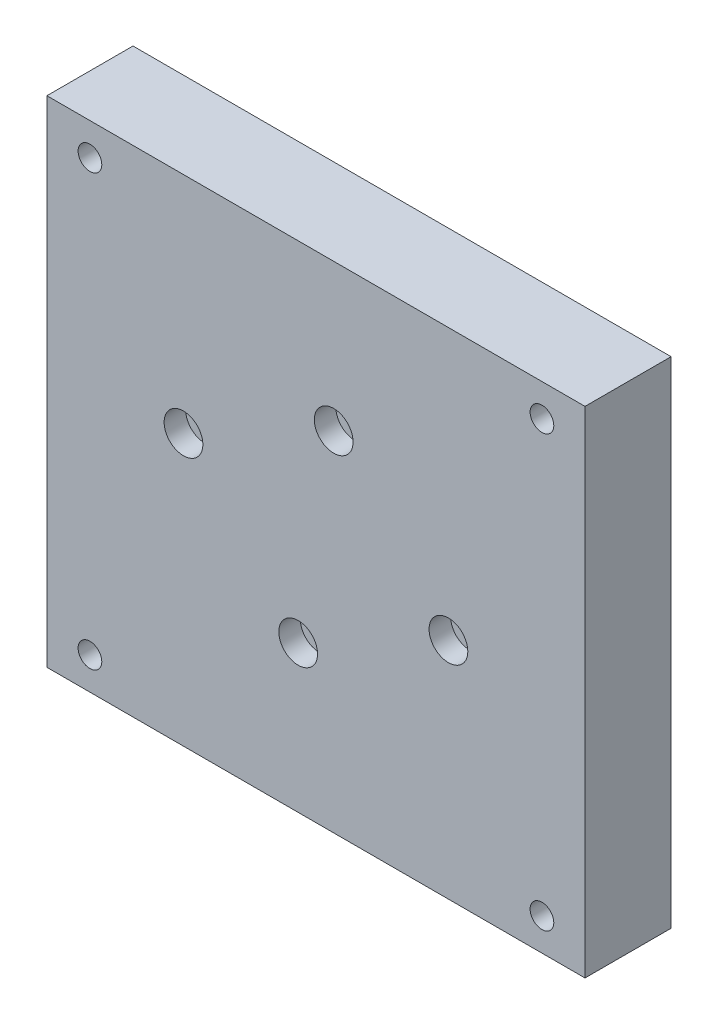
ISO-10303-21;
HEADER;
FILE_DESCRIPTION(('STEP AP214'),'2;1');
FILE_NAME('part.step','',(''),(''),'','','');
FILE_SCHEMA(('AUTOMOTIVE_DESIGN { 1 0 10303 214 1 1 1 1 }'));
ENDSEC;
DATA;
#1=APPLICATION_CONTEXT('core data for automotive mechanical design processes');
#2=APPLICATION_PROTOCOL_DEFINITION('international standard','automotive_design',2000,#1);
#3=PRODUCT_CONTEXT('',#1,'mechanical');
#4=PRODUCT('Part','Part','',(#3));
#5=PRODUCT_RELATED_PRODUCT_CATEGORY('part','',(#4));
#6=PRODUCT_DEFINITION_FORMATION('','',#4);
#7=PRODUCT_DEFINITION_CONTEXT('part definition',#1,'design');
#8=PRODUCT_DEFINITION('design','',#6,#7);
#9=PRODUCT_DEFINITION_SHAPE('','',#8);
#10=(LENGTH_UNIT() NAMED_UNIT(*) SI_UNIT(.MILLI.,.METRE.));
#11=(NAMED_UNIT(*) PLANE_ANGLE_UNIT() SI_UNIT($,.RADIAN.));
#12=(NAMED_UNIT(*) SI_UNIT($,.STERADIAN.) SOLID_ANGLE_UNIT());
#13=UNCERTAINTY_MEASURE_WITH_UNIT(LENGTH_MEASURE(1.E-05),#10,'distance_accuracy_value','');
#14=(GEOMETRIC_REPRESENTATION_CONTEXT(3) GLOBAL_UNCERTAINTY_ASSIGNED_CONTEXT((#13)) GLOBAL_UNIT_ASSIGNED_CONTEXT((#10,
#11,#12)) REPRESENTATION_CONTEXT('',''));
#15=CARTESIAN_POINT('',(0.,0.,0.));
#16=DIRECTION('',(0.,0.,1.));
#17=DIRECTION('',(1.,0.,0.));
#18=AXIS2_PLACEMENT_3D('',#15,#16,#17);
#19=CARTESIAN_POINT('',(25.,-23.,8.));
#20=DIRECTION('',(-1.,0.,0.));
#21=DIRECTION('',(0.,0.,1.));
#22=AXIS2_PLACEMENT_3D('',#19,#20,#21);
#23=PLANE('',#22);
#24=DIRECTION('',(0.,1.,0.));
#25=VECTOR('',#24,1.);
#26=CARTESIAN_POINT('',(25.,-23.,0.));
#27=LINE('',#26,#25);
#28=CARTESIAN_POINT('',(25.,-23.,0.));
#29=VERTEX_POINT('',#28);
#30=CARTESIAN_POINT('',(25.,23.,0.));
#31=VERTEX_POINT('',#30);
#32=EDGE_CURVE('E100',#29,#31,#27,.T.);
#33=ORIENTED_EDGE('',*,*,#32,.T.);
#34=DIRECTION('',(0.,0.,-1.));
#35=VECTOR('',#34,1.);
#36=CARTESIAN_POINT('',(25.,23.,8.));
#37=LINE('',#36,#35);
#38=CARTESIAN_POINT('',(25.,23.,8.));
#39=VERTEX_POINT('',#38);
#40=EDGE_CURVE('E11',#39,#31,#37,.T.);
#41=ORIENTED_EDGE('',*,*,#40,.F.);
#42=DIRECTION('',(0.,1.,0.));
#43=VECTOR('',#42,1.);
#44=CARTESIAN_POINT('',(25.,-23.,8.));
#45=LINE('',#44,#43);
#46=CARTESIAN_POINT('',(25.,-23.,8.));
#47=VERTEX_POINT('',#46);
#48=EDGE_CURVE('E85',#47,#39,#45,.T.);
#49=ORIENTED_EDGE('',*,*,#48,.F.);
#50=DIRECTION('',(0.,0.,-1.));
#51=VECTOR('',#50,1.);
#52=CARTESIAN_POINT('',(25.,-23.,8.));
#53=LINE('',#52,#51);
#54=EDGE_CURVE('E52',#47,#29,#53,.T.);
#55=ORIENTED_EDGE('',*,*,#54,.T.);
#56=EDGE_LOOP('',(#33,#41,#49,#55));
#57=FACE_BOUND('',#56,.T.);
#58=ADVANCED_FACE('F34',(#57),#23,.F.);
#59=CARTESIAN_POINT('',(25.,23.,8.));
#60=DIRECTION('',(0.,-1.,0.));
#61=DIRECTION('',(0.,0.,-1.));
#62=AXIS2_PLACEMENT_3D('',#59,#60,#61);
#63=PLANE('',#62);
#64=DIRECTION('',(-1.,0.,0.));
#65=VECTOR('',#64,1.);
#66=CARTESIAN_POINT('',(25.,23.,0.));
#67=LINE('',#66,#65);
#68=CARTESIAN_POINT('',(-25.,23.,0.));
#69=VERTEX_POINT('',#68);
#70=EDGE_CURVE('E90',#31,#69,#67,.T.);
#71=ORIENTED_EDGE('',*,*,#70,.T.);
#72=DIRECTION('',(0.,0.,-1.));
#73=VECTOR('',#72,1.);
#74=CARTESIAN_POINT('',(-25.,23.,8.));
#75=LINE('',#74,#73);
#76=CARTESIAN_POINT('',(-25.,23.,8.));
#77=VERTEX_POINT('',#76);
#78=EDGE_CURVE('E43',#77,#69,#75,.T.);
#79=ORIENTED_EDGE('',*,*,#78,.F.);
#80=DIRECTION('',(-1.,0.,0.));
#81=VECTOR('',#80,1.);
#82=CARTESIAN_POINT('',(25.,23.,8.));
#83=LINE('',#82,#81);
#84=EDGE_CURVE('E77',#39,#77,#83,.T.);
#85=ORIENTED_EDGE('',*,*,#84,.F.);
#86=ORIENTED_EDGE('',*,*,#40,.T.);
#87=EDGE_LOOP('',(#71,#79,#85,#86));
#88=FACE_BOUND('',#87,.T.);
#89=ADVANCED_FACE('F89',(#88),#63,.F.);
#90=CARTESIAN_POINT('',(-25.,-23.,8.));
#91=DIRECTION('',(-1.,0.,0.));
#92=DIRECTION('',(0.,-1.,0.));
#93=AXIS2_PLACEMENT_3D('',#90,#91,#92);
#94=PLANE('',#93);
#95=DIRECTION('',(0.,1.,0.));
#96=VECTOR('',#95,1.);
#97=CARTESIAN_POINT('',(-25.,-23.,0.));
#98=LINE('',#97,#96);
#99=CARTESIAN_POINT('',(-25.,-23.,0.));
#100=VERTEX_POINT('',#99);
#101=EDGE_CURVE('E104',#100,#69,#98,.T.);
#102=ORIENTED_EDGE('',*,*,#101,.F.);
#103=DIRECTION('',(0.,0.,-1.));
#104=VECTOR('',#103,1.);
#105=CARTESIAN_POINT('',(-25.,-23.,8.));
#106=LINE('',#105,#104);
#107=CARTESIAN_POINT('',(-25.,-23.,8.));
#108=VERTEX_POINT('',#107);
#109=EDGE_CURVE('E66',#108,#100,#106,.T.);
#110=ORIENTED_EDGE('',*,*,#109,.F.);
#111=DIRECTION('',(0.,1.,0.));
#112=VECTOR('',#111,1.);
#113=CARTESIAN_POINT('',(-25.,-23.,8.));
#114=LINE('',#113,#112);
#115=EDGE_CURVE('E84',#108,#77,#114,.T.);
#116=ORIENTED_EDGE('',*,*,#115,.T.);
#117=ORIENTED_EDGE('',*,*,#78,.T.);
#118=EDGE_LOOP('',(#102,#110,#116,#117));
#119=FACE_BOUND('',#118,.T.);
#120=ADVANCED_FACE('F94',(#119),#94,.T.);
#121=CARTESIAN_POINT('',(25.,-23.,8.));
#122=DIRECTION('',(0.,-1.,0.));
#123=DIRECTION('',(0.,0.,-1.));
#124=AXIS2_PLACEMENT_3D('',#121,#122,#123);
#125=PLANE('',#124);
#126=DIRECTION('',(-1.,0.,0.));
#127=VECTOR('',#126,1.);
#128=CARTESIAN_POINT('',(25.,-23.,0.));
#129=LINE('',#128,#127);
#130=EDGE_CURVE('E106',#29,#100,#129,.T.);
#131=ORIENTED_EDGE('',*,*,#130,.F.);
#132=ORIENTED_EDGE('',*,*,#54,.F.);
#133=DIRECTION('',(-1.,0.,0.));
#134=VECTOR('',#133,1.);
#135=CARTESIAN_POINT('',(25.,-23.,8.));
#136=LINE('',#135,#134);
#137=EDGE_CURVE('E95',#47,#108,#136,.T.);
#138=ORIENTED_EDGE('',*,*,#137,.T.);
#139=ORIENTED_EDGE('',*,*,#109,.T.);
#140=EDGE_LOOP('',(#131,#132,#138,#139));
#141=FACE_BOUND('',#140,.T.);
#142=ADVANCED_FACE('F169',(#141),#125,.T.);
#143=CARTESIAN_POINT('',(0.,0.,8.));
#144=DIRECTION('',(0.,0.,1.));
#145=DIRECTION('',(1.,0.,0.));
#146=AXIS2_PLACEMENT_3D('',#143,#144,#145);
#147=PLANE('',#146);
#148=CARTESIAN_POINT('',(21.,20.,8.));
#149=DIRECTION('',(0.,0.,1.));
#150=DIRECTION('',(1.,0.,0.));
#151=AXIS2_PLACEMENT_3D('',#148,#149,#150);
#152=CIRCLE('',#151,1.1);
#153=CARTESIAN_POINT('',(22.1,20.,8.));
#154=VERTEX_POINT('',#153);
#155=EDGE_CURVE('E310',#154,#154,#152,.F.);
#156=ORIENTED_EDGE('',*,*,#155,.T.);
#157=EDGE_LOOP('',(#156));
#158=FACE_BOUND('',#157,.T.);
#159=CARTESIAN_POINT('',(-21.,20.,8.));
#160=DIRECTION('',(0.,0.,1.));
#161=DIRECTION('',(1.,0.,0.));
#162=AXIS2_PLACEMENT_3D('',#159,#160,#161);
#163=CIRCLE('',#162,1.1);
#164=CARTESIAN_POINT('',(-19.9,20.,8.));
#165=VERTEX_POINT('',#164);
#166=EDGE_CURVE('E315',#165,#165,#163,.F.);
#167=ORIENTED_EDGE('',*,*,#166,.T.);
#168=EDGE_LOOP('',(#167));
#169=FACE_BOUND('',#168,.T.);
#170=CARTESIAN_POINT('',(21.,-20.,8.));
#171=DIRECTION('',(0.,0.,1.));
#172=DIRECTION('',(1.,0.,0.));
#173=AXIS2_PLACEMENT_3D('',#170,#171,#172);
#174=CIRCLE('',#173,1.1);
#175=CARTESIAN_POINT('',(22.1,-20.,8.));
#176=VERTEX_POINT('',#175);
#177=EDGE_CURVE('E205',#176,#176,#174,.T.);
#178=ORIENTED_EDGE('',*,*,#177,.F.);
#179=EDGE_LOOP('',(#178));
#180=FACE_BOUND('',#179,.T.);
#181=CARTESIAN_POINT('',(-21.,-20.,8.));
#182=DIRECTION('',(0.,0.,1.));
#183=DIRECTION('',(1.,0.,0.));
#184=AXIS2_PLACEMENT_3D('',#181,#182,#183);
#185=CIRCLE('',#184,1.1);
#186=CARTESIAN_POINT('',(-19.9,-20.,8.));
#187=VERTEX_POINT('',#186);
#188=EDGE_CURVE('E204',#187,#187,#185,.T.);
#189=ORIENTED_EDGE('',*,*,#188,.F.);
#190=EDGE_LOOP('',(#189));
#191=FACE_BOUND('',#190,.T.);
#192=CARTESIAN_POINT('',(1.64965768783578,9.35567365361599,8.));
#193=DIRECTION('',(0.,0.,1.));
#194=DIRECTION('',(1.,0.,0.));
#195=AXIS2_PLACEMENT_3D('',#192,#193,#194);
#196=CIRCLE('',#195,1.8);
#197=CARTESIAN_POINT('',(3.44965768783578,9.35567365361599,8.));
#198=VERTEX_POINT('',#197);
#199=EDGE_CURVE('E216',#198,#198,#196,.T.);
#200=ORIENTED_EDGE('',*,*,#199,.F.);
#201=EDGE_LOOP('',(#200));
#202=FACE_BOUND('',#201,.T.);
#203=CARTESIAN_POINT('',(12.3100969126526,-2.17060222083655,8.));
#204=DIRECTION('',(0.,0.,1.));
#205=DIRECTION('',(1.,0.,0.));
#206=AXIS2_PLACEMENT_3D('',#203,#204,#205);
#207=CIRCLE('',#206,1.8);
#208=CARTESIAN_POINT('',(14.1100969126526,-2.17060222083655,8.));
#209=VERTEX_POINT('',#208);
#210=EDGE_CURVE('E222',#209,#209,#207,.T.);
#211=ORIENTED_EDGE('',*,*,#210,.F.);
#212=EDGE_LOOP('',(#211));
#213=FACE_BOUND('',#212,.T.);
#214=CARTESIAN_POINT('',(-1.64965768783577,-9.35567365361599,8.));
#215=DIRECTION('',(0.,0.,1.));
#216=DIRECTION('',(1.,0.,0.));
#217=AXIS2_PLACEMENT_3D('',#214,#215,#216);
#218=CIRCLE('',#217,1.8);
#219=CARTESIAN_POINT('',(0.150342312164225,-9.35567365361599,8.));
#220=VERTEX_POINT('',#219);
#221=EDGE_CURVE('E208',#220,#220,#218,.T.);
#222=ORIENTED_EDGE('',*,*,#221,.F.);
#223=EDGE_LOOP('',(#222));
#224=FACE_BOUND('',#223,.T.);
#225=CARTESIAN_POINT('',(-12.3100969126526,2.17060222083655,8.));
#226=DIRECTION('',(0.,0.,1.));
#227=DIRECTION('',(1.,0.,0.));
#228=AXIS2_PLACEMENT_3D('',#225,#226,#227);
#229=CIRCLE('',#228,1.8);
#230=CARTESIAN_POINT('',(-10.5100969126526,2.17060222083655,8.));
#231=VERTEX_POINT('',#230);
#232=EDGE_CURVE('E124',#231,#231,#229,.T.);
#233=ORIENTED_EDGE('',*,*,#232,.F.);
#234=EDGE_LOOP('',(#233));
#235=FACE_BOUND('',#234,.T.);
#236=ORIENTED_EDGE('',*,*,#48,.T.);
#237=ORIENTED_EDGE('',*,*,#84,.T.);
#238=ORIENTED_EDGE('',*,*,#115,.F.);
#239=ORIENTED_EDGE('',*,*,#137,.F.);
#240=EDGE_LOOP('',(#236,#237,#238,#239));
#241=FACE_BOUND('',#240,.T.);
#242=ADVANCED_FACE('F81',(#158,#169,#180,#191,#202,#213,#224,#235,#241),#147,.T.);
#243=CARTESIAN_POINT('',(0.,0.,0.));
#244=DIRECTION('',(0.,0.,1.));
#245=DIRECTION('',(1.,0.,0.));
#246=AXIS2_PLACEMENT_3D('',#243,#244,#245);
#247=PLANE('',#246);
#248=CARTESIAN_POINT('',(21.,20.,0.));
#249=DIRECTION('',(0.,0.,1.));
#250=DIRECTION('',(-1.,0.,0.));
#251=AXIS2_PLACEMENT_3D('',#248,#249,#250);
#252=CIRCLE('',#251,1.1);
#253=CARTESIAN_POINT('',(19.9,20.,0.));
#254=VERTEX_POINT('',#253);
#255=EDGE_CURVE('E191',#254,#254,#252,.T.);
#256=ORIENTED_EDGE('',*,*,#255,.T.);
#257=EDGE_LOOP('',(#256));
#258=FACE_BOUND('',#257,.T.);
#259=CARTESIAN_POINT('',(-21.,20.,0.));
#260=DIRECTION('',(0.,0.,1.));
#261=DIRECTION('',(-1.,0.,0.));
#262=AXIS2_PLACEMENT_3D('',#259,#260,#261);
#263=CIRCLE('',#262,1.1);
#264=CARTESIAN_POINT('',(-22.1,20.,0.));
#265=VERTEX_POINT('',#264);
#266=EDGE_CURVE('E195',#265,#265,#263,.T.);
#267=ORIENTED_EDGE('',*,*,#266,.T.);
#268=EDGE_LOOP('',(#267));
#269=FACE_BOUND('',#268,.T.);
#270=CARTESIAN_POINT('',(21.,-20.,0.));
#271=DIRECTION('',(0.,0.,-1.));
#272=DIRECTION('',(-1.,0.,0.));
#273=AXIS2_PLACEMENT_3D('',#270,#271,#272);
#274=CIRCLE('',#273,1.1);
#275=CARTESIAN_POINT('',(19.9,-20.,0.));
#276=VERTEX_POINT('',#275);
#277=EDGE_CURVE('E199',#276,#276,#274,.T.);
#278=ORIENTED_EDGE('',*,*,#277,.F.);
#279=EDGE_LOOP('',(#278));
#280=FACE_BOUND('',#279,.T.);
#281=CARTESIAN_POINT('',(-21.,-20.,0.));
#282=DIRECTION('',(0.,0.,-1.));
#283=DIRECTION('',(-1.,0.,0.));
#284=AXIS2_PLACEMENT_3D('',#281,#282,#283);
#285=CIRCLE('',#284,1.1);
#286=CARTESIAN_POINT('',(-22.1,-20.,0.));
#287=VERTEX_POINT('',#286);
#288=EDGE_CURVE('E202',#287,#287,#285,.T.);
#289=ORIENTED_EDGE('',*,*,#288,.F.);
#290=EDGE_LOOP('',(#289));
#291=FACE_BOUND('',#290,.T.);
#292=ORIENTED_EDGE('',*,*,#32,.F.);
#293=ORIENTED_EDGE('',*,*,#130,.T.);
#294=ORIENTED_EDGE('',*,*,#101,.T.);
#295=ORIENTED_EDGE('',*,*,#70,.F.);
#296=EDGE_LOOP('',(#292,#293,#294,#295));
#297=FACE_BOUND('',#296,.T.);
#298=ADVANCED_FACE('F168',(#258,#269,#280,#291,#297),#247,.F.);
#299=CARTESIAN_POINT('',(-12.3100969126526,2.17060222083655,6.));
#300=DIRECTION('',(0.,0.,1.));
#301=DIRECTION('',(1.,0.,0.));
#302=AXIS2_PLACEMENT_3D('',#299,#300,#301);
#303=PLANE('',#302);
#304=CARTESIAN_POINT('',(-12.3100969126526,2.17060222083655,6.));
#305=DIRECTION('',(0.,0.,1.));
#306=DIRECTION('',(1.,0.,0.));
#307=AXIS2_PLACEMENT_3D('',#304,#305,#306);
#308=CIRCLE('',#307,1.8);
#309=CARTESIAN_POINT('',(-10.5100969126526,2.17060222083655,6.));
#310=VERTEX_POINT('',#309);
#311=EDGE_CURVE('E115',#310,#310,#308,.T.);
#312=ORIENTED_EDGE('',*,*,#311,.T.);
#313=EDGE_LOOP('',(#312));
#314=FACE_BOUND('',#313,.T.);
#315=CARTESIAN_POINT('',(-12.3100969126526,2.17060222083655,6.));
#316=DIRECTION('',(0.,0.,1.));
#317=DIRECTION('',(1.,0.,0.));
#318=AXIS2_PLACEMENT_3D('',#315,#316,#317);
#319=CIRCLE('',#318,1.02499999999999);
#320=CARTESIAN_POINT('',(-11.2850969126526,2.17060222083655,6.));
#321=VERTEX_POINT('',#320);
#322=EDGE_CURVE('E111',#321,#321,#319,.F.);
#323=ORIENTED_EDGE('',*,*,#322,.T.);
#324=EDGE_LOOP('',(#323));
#325=FACE_BOUND('',#324,.T.);
#326=ADVANCED_FACE('F180',(#314,#325),#303,.T.);
#327=CARTESIAN_POINT('',(-12.3100969126526,2.17060222083655,6.));
#328=DIRECTION('',(0.,0.,1.));
#329=DIRECTION('',(1.,0.,0.));
#330=AXIS2_PLACEMENT_3D('',#327,#328,#329);
#331=CYLINDRICAL_SURFACE('',#330,1.8);
#332=ORIENTED_EDGE('',*,*,#311,.F.);
#333=EDGE_LOOP('',(#332));
#334=FACE_BOUND('',#333,.T.);
#335=ORIENTED_EDGE('',*,*,#232,.T.);
#336=EDGE_LOOP('',(#335));
#337=FACE_BOUND('',#336,.T.);
#338=ADVANCED_FACE('F185',(#334,#337),#331,.F.);
#339=CARTESIAN_POINT('',(-12.3100969126526,2.17060222083655,3.));
#340=DIRECTION('',(0.,0.,1.));
#341=DIRECTION('',(1.,0.,0.));
#342=AXIS2_PLACEMENT_3D('',#339,#340,#341);
#343=PLANE('',#342);
#344=CARTESIAN_POINT('',(-12.3100969126526,2.17060222083655,3.));
#345=DIRECTION('',(0.,0.,1.));
#346=DIRECTION('',(1.,0.,0.));
#347=AXIS2_PLACEMENT_3D('',#344,#345,#346);
#348=CIRCLE('',#347,1.02499999999999);
#349=CARTESIAN_POINT('',(-11.2850969126526,2.17060222083655,3.));
#350=VERTEX_POINT('',#349);
#351=EDGE_CURVE('E114',#350,#350,#348,.T.);
#352=ORIENTED_EDGE('',*,*,#351,.T.);
#353=EDGE_LOOP('',(#352));
#354=FACE_BOUND('',#353,.T.);
#355=ADVANCED_FACE('F252',(#354),#343,.T.);
#356=CARTESIAN_POINT('',(-12.3100969126526,2.17060222083655,3.));
#357=DIRECTION('',(0.,0.,1.));
#358=DIRECTION('',(1.,0.,0.));
#359=AXIS2_PLACEMENT_3D('',#356,#357,#358);
#360=CYLINDRICAL_SURFACE('',#359,1.02499999999999);
#361=ORIENTED_EDGE('',*,*,#351,.F.);
#362=EDGE_LOOP('',(#361));
#363=FACE_BOUND('',#362,.T.);
#364=ORIENTED_EDGE('',*,*,#322,.F.);
#365=EDGE_LOOP('',(#364));
#366=FACE_BOUND('',#365,.T.);
#367=ADVANCED_FACE('F267',(#363,#366),#360,.F.);
#368=CARTESIAN_POINT('',(12.3100969126526,-2.17060222083655,6.));
#369=DIRECTION('',(0.,0.,1.));
#370=DIRECTION('',(1.,0.,0.));
#371=AXIS2_PLACEMENT_3D('',#368,#369,#370);
#372=PLANE('',#371);
#373=CARTESIAN_POINT('',(12.3100969126526,-2.17060222083655,6.));
#374=DIRECTION('',(0.,0.,1.));
#375=DIRECTION('',(1.,0.,0.));
#376=AXIS2_PLACEMENT_3D('',#373,#374,#375);
#377=CIRCLE('',#376,1.8);
#378=CARTESIAN_POINT('',(14.1100969126526,-2.17060222083655,6.));
#379=VERTEX_POINT('',#378);
#380=EDGE_CURVE('E219',#379,#379,#377,.T.);
#381=ORIENTED_EDGE('',*,*,#380,.T.);
#382=EDGE_LOOP('',(#381));
#383=FACE_BOUND('',#382,.T.);
#384=CARTESIAN_POINT('',(12.3100969126526,-2.17060222083655,6.));
#385=DIRECTION('',(0.,0.,1.));
#386=DIRECTION('',(1.,0.,0.));
#387=AXIS2_PLACEMENT_3D('',#384,#385,#386);
#388=CIRCLE('',#387,1.02499999999999);
#389=CARTESIAN_POINT('',(13.3350969126526,-2.17060222083655,6.));
#390=VERTEX_POINT('',#389);
#391=EDGE_CURVE('E116',#390,#390,#388,.F.);
#392=ORIENTED_EDGE('',*,*,#391,.T.);
#393=EDGE_LOOP('',(#392));
#394=FACE_BOUND('',#393,.T.);
#395=ADVANCED_FACE('F270',(#383,#394),#372,.T.);
#396=CARTESIAN_POINT('',(12.3100969126526,-2.17060222083655,6.));
#397=DIRECTION('',(0.,0.,1.));
#398=DIRECTION('',(1.,0.,0.));
#399=AXIS2_PLACEMENT_3D('',#396,#397,#398);
#400=CYLINDRICAL_SURFACE('',#399,1.8);
#401=ORIENTED_EDGE('',*,*,#380,.F.);
#402=EDGE_LOOP('',(#401));
#403=FACE_BOUND('',#402,.T.);
#404=ORIENTED_EDGE('',*,*,#210,.T.);
#405=EDGE_LOOP('',(#404));
#406=FACE_BOUND('',#405,.T.);
#407=ADVANCED_FACE('F275',(#403,#406),#400,.F.);
#408=CARTESIAN_POINT('',(1.64965768783578,9.35567365361599,6.));
#409=DIRECTION('',(0.,0.,1.));
#410=DIRECTION('',(1.,0.,0.));
#411=AXIS2_PLACEMENT_3D('',#408,#409,#410);
#412=PLANE('',#411);
#413=CARTESIAN_POINT('',(1.64965768783578,9.35567365361599,6.));
#414=DIRECTION('',(0.,0.,1.));
#415=DIRECTION('',(1.,0.,0.));
#416=AXIS2_PLACEMENT_3D('',#413,#414,#415);
#417=CIRCLE('',#416,1.8);
#418=CARTESIAN_POINT('',(3.44965768783578,9.35567365361599,6.));
#419=VERTEX_POINT('',#418);
#420=EDGE_CURVE('E119',#419,#419,#417,.T.);
#421=ORIENTED_EDGE('',*,*,#420,.T.);
#422=EDGE_LOOP('',(#421));
#423=FACE_BOUND('',#422,.T.);
#424=CARTESIAN_POINT('',(1.64965768783578,9.35567365361599,6.));
#425=DIRECTION('',(0.,0.,1.));
#426=DIRECTION('',(1.,0.,0.));
#427=AXIS2_PLACEMENT_3D('',#424,#425,#426);
#428=CIRCLE('',#427,1.02499999999999);
#429=CARTESIAN_POINT('',(2.67465768783577,9.35567365361599,6.));
#430=VERTEX_POINT('',#429);
#431=EDGE_CURVE('E118',#430,#430,#428,.F.);
#432=ORIENTED_EDGE('',*,*,#431,.T.);
#433=EDGE_LOOP('',(#432));
#434=FACE_BOUND('',#433,.T.);
#435=ADVANCED_FACE('F285',(#423,#434),#412,.T.);
#436=CARTESIAN_POINT('',(1.64965768783578,9.35567365361599,6.));
#437=DIRECTION('',(0.,0.,1.));
#438=DIRECTION('',(1.,0.,0.));
#439=AXIS2_PLACEMENT_3D('',#436,#437,#438);
#440=CYLINDRICAL_SURFACE('',#439,1.8);
#441=ORIENTED_EDGE('',*,*,#420,.F.);
#442=EDGE_LOOP('',(#441));
#443=FACE_BOUND('',#442,.T.);
#444=ORIENTED_EDGE('',*,*,#199,.T.);
#445=EDGE_LOOP('',(#444));
#446=FACE_BOUND('',#445,.T.);
#447=ADVANCED_FACE('F245',(#443,#446),#440,.F.);
#448=CARTESIAN_POINT('',(-1.64965768783577,-9.35567365361599,6.));
#449=DIRECTION('',(0.,0.,1.));
#450=DIRECTION('',(1.,0.,0.));
#451=AXIS2_PLACEMENT_3D('',#448,#449,#450);
#452=PLANE('',#451);
#453=CARTESIAN_POINT('',(-1.64965768783577,-9.35567365361599,6.));
#454=DIRECTION('',(0.,0.,1.));
#455=DIRECTION('',(1.,0.,0.));
#456=AXIS2_PLACEMENT_3D('',#453,#454,#455);
#457=CIRCLE('',#456,1.8);
#458=CARTESIAN_POINT('',(0.150342312164225,-9.35567365361599,6.));
#459=VERTEX_POINT('',#458);
#460=EDGE_CURVE('E225',#459,#459,#457,.T.);
#461=ORIENTED_EDGE('',*,*,#460,.T.);
#462=EDGE_LOOP('',(#461));
#463=FACE_BOUND('',#462,.T.);
#464=CARTESIAN_POINT('',(-1.64965768783577,-9.35567365361599,6.));
#465=DIRECTION('',(0.,0.,1.));
#466=DIRECTION('',(1.,0.,0.));
#467=AXIS2_PLACEMENT_3D('',#464,#465,#466);
#468=CIRCLE('',#467,1.02499999999999);
#469=CARTESIAN_POINT('',(-0.624657687835783,-9.35567365361599,6.));
#470=VERTEX_POINT('',#469);
#471=EDGE_CURVE('E37',#470,#470,#468,.F.);
#472=ORIENTED_EDGE('',*,*,#471,.T.);
#473=EDGE_LOOP('',(#472));
#474=FACE_BOUND('',#473,.T.);
#475=ADVANCED_FACE('F235',(#463,#474),#452,.T.);
#476=CARTESIAN_POINT('',(-1.64965768783577,-9.35567365361599,6.));
#477=DIRECTION('',(0.,0.,1.));
#478=DIRECTION('',(1.,0.,0.));
#479=AXIS2_PLACEMENT_3D('',#476,#477,#478);
#480=CYLINDRICAL_SURFACE('',#479,1.8);
#481=ORIENTED_EDGE('',*,*,#460,.F.);
#482=EDGE_LOOP('',(#481));
#483=FACE_BOUND('',#482,.T.);
#484=ORIENTED_EDGE('',*,*,#221,.T.);
#485=EDGE_LOOP('',(#484));
#486=FACE_BOUND('',#485,.T.);
#487=ADVANCED_FACE('F230',(#483,#486),#480,.F.);
#488=CARTESIAN_POINT('',(12.3100969126526,-2.17060222083655,3.));
#489=DIRECTION('',(0.,0.,1.));
#490=DIRECTION('',(1.,0.,0.));
#491=AXIS2_PLACEMENT_3D('',#488,#489,#490);
#492=PLANE('',#491);
#493=CARTESIAN_POINT('',(12.3100969126526,-2.17060222083655,3.));
#494=DIRECTION('',(0.,0.,1.));
#495=DIRECTION('',(1.,0.,0.));
#496=AXIS2_PLACEMENT_3D('',#493,#494,#495);
#497=CIRCLE('',#496,1.02499999999999);
#498=CARTESIAN_POINT('',(13.3350969126526,-2.17060222083655,3.));
#499=VERTEX_POINT('',#498);
#500=EDGE_CURVE('E135',#499,#499,#497,.T.);
#501=ORIENTED_EDGE('',*,*,#500,.T.);
#502=EDGE_LOOP('',(#501));
#503=FACE_BOUND('',#502,.T.);
#504=ADVANCED_FACE('F234',(#503),#492,.T.);
#505=CARTESIAN_POINT('',(12.3100969126526,-2.17060222083655,3.));
#506=DIRECTION('',(0.,0.,1.));
#507=DIRECTION('',(1.,0.,0.));
#508=AXIS2_PLACEMENT_3D('',#505,#506,#507);
#509=CYLINDRICAL_SURFACE('',#508,1.02499999999999);
#510=ORIENTED_EDGE('',*,*,#500,.F.);
#511=EDGE_LOOP('',(#510));
#512=FACE_BOUND('',#511,.T.);
#513=ORIENTED_EDGE('',*,*,#391,.F.);
#514=EDGE_LOOP('',(#513));
#515=FACE_BOUND('',#514,.T.);
#516=ADVANCED_FACE('F242',(#512,#515),#509,.F.);
#517=CARTESIAN_POINT('',(1.64965768783578,9.35567365361599,3.));
#518=DIRECTION('',(0.,0.,1.));
#519=DIRECTION('',(1.,0.,0.));
#520=AXIS2_PLACEMENT_3D('',#517,#518,#519);
#521=PLANE('',#520);
#522=CARTESIAN_POINT('',(1.64965768783578,9.35567365361599,3.));
#523=DIRECTION('',(0.,0.,1.));
#524=DIRECTION('',(1.,0.,0.));
#525=AXIS2_PLACEMENT_3D('',#522,#523,#524);
#526=CIRCLE('',#525,1.02499999999999);
#527=CARTESIAN_POINT('',(2.67465768783577,9.35567365361599,3.));
#528=VERTEX_POINT('',#527);
#529=EDGE_CURVE('E138',#528,#528,#526,.T.);
#530=ORIENTED_EDGE('',*,*,#529,.T.);
#531=EDGE_LOOP('',(#530));
#532=FACE_BOUND('',#531,.T.);
#533=ADVANCED_FACE('F257',(#532),#521,.T.);
#534=CARTESIAN_POINT('',(1.64965768783578,9.35567365361599,3.));
#535=DIRECTION('',(0.,0.,1.));
#536=DIRECTION('',(1.,0.,0.));
#537=AXIS2_PLACEMENT_3D('',#534,#535,#536);
#538=CYLINDRICAL_SURFACE('',#537,1.02499999999999);
#539=ORIENTED_EDGE('',*,*,#529,.F.);
#540=EDGE_LOOP('',(#539));
#541=FACE_BOUND('',#540,.T.);
#542=ORIENTED_EDGE('',*,*,#431,.F.);
#543=EDGE_LOOP('',(#542));
#544=FACE_BOUND('',#543,.T.);
#545=ADVANCED_FACE('F160',(#541,#544),#538,.F.);
#546=CARTESIAN_POINT('',(-1.64965768783577,-9.35567365361599,3.));
#547=DIRECTION('',(0.,0.,1.));
#548=DIRECTION('',(1.,0.,0.));
#549=AXIS2_PLACEMENT_3D('',#546,#547,#548);
#550=PLANE('',#549);
#551=CARTESIAN_POINT('',(-1.64965768783577,-9.35567365361599,3.));
#552=DIRECTION('',(0.,0.,1.));
#553=DIRECTION('',(1.,0.,0.));
#554=AXIS2_PLACEMENT_3D('',#551,#552,#553);
#555=CIRCLE('',#554,1.02499999999999);
#556=CARTESIAN_POINT('',(-0.624657687835783,-9.35567365361599,3.));
#557=VERTEX_POINT('',#556);
#558=EDGE_CURVE('E102',#557,#557,#555,.T.);
#559=ORIENTED_EDGE('',*,*,#558,.T.);
#560=EDGE_LOOP('',(#559));
#561=FACE_BOUND('',#560,.T.);
#562=ADVANCED_FACE('F146',(#561),#550,.T.);
#563=CARTESIAN_POINT('',(-1.64965768783577,-9.35567365361599,3.));
#564=DIRECTION('',(0.,0.,1.));
#565=DIRECTION('',(1.,0.,0.));
#566=AXIS2_PLACEMENT_3D('',#563,#564,#565);
#567=CYLINDRICAL_SURFACE('',#566,1.02499999999999);
#568=ORIENTED_EDGE('',*,*,#558,.F.);
#569=EDGE_LOOP('',(#568));
#570=FACE_BOUND('',#569,.T.);
#571=ORIENTED_EDGE('',*,*,#471,.F.);
#572=EDGE_LOOP('',(#571));
#573=FACE_BOUND('',#572,.T.);
#574=ADVANCED_FACE('F148',(#570,#573),#567,.F.);
#575=CARTESIAN_POINT('',(-21.,-20.,24.));
#576=DIRECTION('',(0.,0.,-1.));
#577=DIRECTION('',(-1.,0.,0.));
#578=AXIS2_PLACEMENT_3D('',#575,#576,#577);
#579=CYLINDRICAL_SURFACE('',#578,1.1);
#580=ORIENTED_EDGE('',*,*,#188,.T.);
#581=EDGE_LOOP('',(#580));
#582=FACE_BOUND('',#581,.T.);
#583=ORIENTED_EDGE('',*,*,#288,.T.);
#584=EDGE_LOOP('',(#583));
#585=FACE_BOUND('',#584,.T.);
#586=ADVANCED_FACE('F151',(#582,#585),#579,.F.);
#587=CARTESIAN_POINT('',(21.,-20.,24.));
#588=DIRECTION('',(0.,0.,-1.));
#589=DIRECTION('',(-1.,0.,0.));
#590=AXIS2_PLACEMENT_3D('',#587,#588,#589);
#591=CYLINDRICAL_SURFACE('',#590,1.1);
#592=ORIENTED_EDGE('',*,*,#177,.T.);
#593=EDGE_LOOP('',(#592));
#594=FACE_BOUND('',#593,.T.);
#595=ORIENTED_EDGE('',*,*,#277,.T.);
#596=EDGE_LOOP('',(#595));
#597=FACE_BOUND('',#596,.T.);
#598=ADVANCED_FACE('F157',(#594,#597),#591,.F.);
#599=CARTESIAN_POINT('',(-21.,20.,24.));
#600=DIRECTION('',(0.,0.,-1.));
#601=DIRECTION('',(-1.,0.,0.));
#602=AXIS2_PLACEMENT_3D('',#599,#600,#601);
#603=CYLINDRICAL_SURFACE('',#602,1.1);
#604=ORIENTED_EDGE('',*,*,#166,.F.);
#605=EDGE_LOOP('',(#604));
#606=FACE_BOUND('',#605,.T.);
#607=ORIENTED_EDGE('',*,*,#266,.F.);
#608=EDGE_LOOP('',(#607));
#609=FACE_BOUND('',#608,.T.);
#610=ADVANCED_FACE('F297',(#606,#609),#603,.F.);
#611=CARTESIAN_POINT('',(21.,20.,24.));
#612=DIRECTION('',(0.,0.,-1.));
#613=DIRECTION('',(-1.,0.,0.));
#614=AXIS2_PLACEMENT_3D('',#611,#612,#613);
#615=CYLINDRICAL_SURFACE('',#614,1.1);
#616=ORIENTED_EDGE('',*,*,#155,.F.);
#617=EDGE_LOOP('',(#616));
#618=FACE_BOUND('',#617,.T.);
#619=ORIENTED_EDGE('',*,*,#255,.F.);
#620=EDGE_LOOP('',(#619));
#621=FACE_BOUND('',#620,.T.);
#622=ADVANCED_FACE('F301',(#618,#621),#615,.F.);
#623=CLOSED_SHELL('',(#58,#89,#120,#142,#242,#298,#326,#338,#355,#367,#395,#407,#435,#447,#475,
#487,#504,#516,#533,#545,#562,#574,#586,#598,#610,#622));
#624=MANIFOLD_SOLID_BREP('B2',#623);
#625=ADVANCED_BREP_SHAPE_REPRESENTATION('',(#18,#624),#14);
#626=SHAPE_DEFINITION_REPRESENTATION(#9,#625);
ENDSEC;
END-ISO-10303-21;
